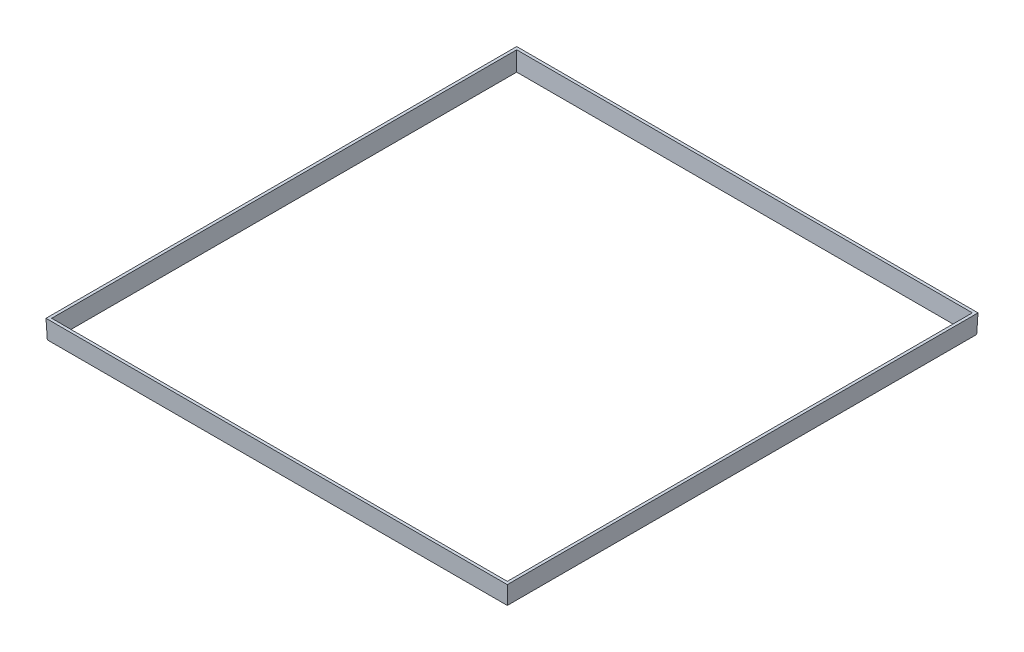
ISO-10303-21;
HEADER;
FILE_DESCRIPTION(('STEP AP214'),'2;1');
FILE_NAME('part.step','',(''),(''),'','','');
FILE_SCHEMA(('AUTOMOTIVE_DESIGN { 1 0 10303 214 1 1 1 1 }'));
ENDSEC;
DATA;
#1=APPLICATION_CONTEXT('core data for automotive mechanical design processes');
#2=APPLICATION_PROTOCOL_DEFINITION('international standard','automotive_design',2000,#1);
#3=PRODUCT_CONTEXT('',#1,'mechanical');
#4=PRODUCT('Part','Part','',(#3));
#5=PRODUCT_RELATED_PRODUCT_CATEGORY('part','',(#4));
#6=PRODUCT_DEFINITION_FORMATION('','',#4);
#7=PRODUCT_DEFINITION_CONTEXT('part definition',#1,'design');
#8=PRODUCT_DEFINITION('design','',#6,#7);
#9=PRODUCT_DEFINITION_SHAPE('','',#8);
#10=(LENGTH_UNIT() NAMED_UNIT(*) SI_UNIT(.MILLI.,.METRE.));
#11=(NAMED_UNIT(*) PLANE_ANGLE_UNIT() SI_UNIT($,.RADIAN.));
#12=(NAMED_UNIT(*) SI_UNIT($,.STERADIAN.) SOLID_ANGLE_UNIT());
#13=UNCERTAINTY_MEASURE_WITH_UNIT(LENGTH_MEASURE(1.E-05),#10,'distance_accuracy_value','');
#14=(GEOMETRIC_REPRESENTATION_CONTEXT(3) GLOBAL_UNCERTAINTY_ASSIGNED_CONTEXT((#13)) GLOBAL_UNIT_ASSIGNED_CONTEXT((#10,
#11,#12)) REPRESENTATION_CONTEXT('',''));
#15=CARTESIAN_POINT('',(0.,0.,0.));
#16=DIRECTION('',(0.,0.,1.));
#17=DIRECTION('',(1.,0.,0.));
#18=AXIS2_PLACEMENT_3D('',#15,#16,#17);
#19=CARTESIAN_POINT('',(123.,0.,125.5));
#20=DIRECTION('',(0.999390827019096,-0.034899496702501,0.));
#21=DIRECTION('',(0.034899496702501,0.999390827019096,0.));
#22=AXIS2_PLACEMENT_3D('',#19,#20,#21);
#23=PLANE('',#22);
#24=DIRECTION('',(0.,0.,1.));
#25=VECTOR('',#24,1.);
#26=CARTESIAN_POINT('',(122.651217372576,-9.98782765958718,-125.5));
#27=LINE('',#26,#25);
#28=CARTESIAN_POINT('',(122.651217372576,-9.98782765958718,-125.151217372576));
#29=VERTEX_POINT('',#28);
#30=CARTESIAN_POINT('',(122.651217372576,-9.98782765958718,125.151217372576));
#31=VERTEX_POINT('',#30);
#32=EDGE_CURVE('E104',#29,#31,#27,.T.);
#33=ORIENTED_EDGE('',*,*,#32,.F.);
#34=DIRECTION('',(0.0348782627423747,0.998782765958718,-0.0348782627423747));
#35=VECTOR('',#34,1.);
#36=CARTESIAN_POINT('',(122.694660203806,-8.74378774114964,-125.194660203806));
#37=LINE('',#36,#35);
#38=CARTESIAN_POINT('',(123.,0.,-125.5));
#39=VERTEX_POINT('',#38);
#40=EDGE_CURVE('E121',#29,#39,#37,.T.);
#41=ORIENTED_EDGE('',*,*,#40,.T.);
#42=DIRECTION('',(0.,0.,-1.));
#43=VECTOR('',#42,1.);
#44=CARTESIAN_POINT('',(123.,0.,125.5));
#45=LINE('',#44,#43);
#46=CARTESIAN_POINT('',(123.,0.,125.5));
#47=VERTEX_POINT('',#46);
#48=EDGE_CURVE('E131',#47,#39,#45,.T.);
#49=ORIENTED_EDGE('',*,*,#48,.F.);
#50=DIRECTION('',(0.0348782627423747,0.998782765958718,0.0348782627423747));
#51=VECTOR('',#50,1.);
#52=CARTESIAN_POINT('',(122.700742669866,-8.56960870248132,125.200742669866));
#53=LINE('',#52,#51);
#54=EDGE_CURVE('E47',#31,#47,#53,.T.);
#55=ORIENTED_EDGE('',*,*,#54,.F.);
#56=EDGE_LOOP('',(#33,#41,#49,#55));
#57=FACE_BOUND('',#56,.T.);
#58=ADVANCED_FACE('F39',(#57),#23,.T.);
#59=CARTESIAN_POINT('',(-123.,0.,125.5));
#60=DIRECTION('',(0.,-0.034899496702501,0.999390827019096));
#61=DIRECTION('',(0.,-0.999390827019096,-0.034899496702501));
#62=AXIS2_PLACEMENT_3D('',#59,#60,#61);
#63=PLANE('',#62);
#64=DIRECTION('',(-1.,0.,0.));
#65=VECTOR('',#64,1.);
#66=CARTESIAN_POINT('',(-122.651217372576,-9.98782765958718,125.151217372576));
#67=LINE('',#66,#65);
#68=CARTESIAN_POINT('',(-122.651217372576,-9.98782765958718,125.151217372576));
#69=VERTEX_POINT('',#68);
#70=EDGE_CURVE('E101',#31,#69,#67,.T.);
#71=ORIENTED_EDGE('',*,*,#70,.F.);
#72=ORIENTED_EDGE('',*,*,#54,.T.);
#73=DIRECTION('',(1.,0.,0.));
#74=VECTOR('',#73,1.);
#75=CARTESIAN_POINT('',(-123.,0.,125.5));
#76=LINE('',#75,#74);
#77=CARTESIAN_POINT('',(-123.,0.,125.5));
#78=VERTEX_POINT('',#77);
#79=EDGE_CURVE('E119',#78,#47,#76,.T.);
#80=ORIENTED_EDGE('',*,*,#79,.F.);
#81=DIRECTION('',(-0.0348782627423747,0.998782765958718,0.0348782627423747));
#82=VECTOR('',#81,1.);
#83=CARTESIAN_POINT('',(-123.,0.,125.5));
#84=LINE('',#83,#82);
#85=EDGE_CURVE('E113',#69,#78,#84,.T.);
#86=ORIENTED_EDGE('',*,*,#85,.F.);
#87=EDGE_LOOP('',(#71,#72,#80,#86));
#88=FACE_BOUND('',#87,.T.);
#89=ADVANCED_FACE('F41',(#88),#63,.T.);
#90=CARTESIAN_POINT('',(-123.,0.,125.5));
#91=DIRECTION('',(-0.999390827019096,-0.034899496702501,0.));
#92=DIRECTION('',(0.034899496702501,-0.999390827019096,0.));
#93=AXIS2_PLACEMENT_3D('',#90,#91,#92);
#94=PLANE('',#93);
#95=DIRECTION('',(0.,0.,1.));
#96=VECTOR('',#95,1.);
#97=CARTESIAN_POINT('',(-122.651217372576,-9.98782765958718,-125.5));
#98=LINE('',#97,#96);
#99=CARTESIAN_POINT('',(-122.651217372576,-9.98782765958718,-125.151217372576));
#100=VERTEX_POINT('',#99);
#101=EDGE_CURVE('E54',#100,#69,#98,.T.);
#102=ORIENTED_EDGE('',*,*,#101,.T.);
#103=ORIENTED_EDGE('',*,*,#85,.T.);
#104=DIRECTION('',(0.,0.,1.));
#105=VECTOR('',#104,1.);
#106=CARTESIAN_POINT('',(-123.,0.,125.5));
#107=LINE('',#106,#105);
#108=CARTESIAN_POINT('',(-123.,0.,-125.5));
#109=VERTEX_POINT('',#108);
#110=EDGE_CURVE('E126',#109,#78,#107,.T.);
#111=ORIENTED_EDGE('',*,*,#110,.F.);
#112=DIRECTION('',(-0.0348782627423747,0.998782765958718,-0.0348782627423747));
#113=VECTOR('',#112,1.);
#114=CARTESIAN_POINT('',(-123.,0.,-125.5));
#115=LINE('',#114,#113);
#116=EDGE_CURVE('E115',#100,#109,#115,.T.);
#117=ORIENTED_EDGE('',*,*,#116,.F.);
#118=EDGE_LOOP('',(#102,#103,#111,#117));
#119=FACE_BOUND('',#118,.T.);
#120=ADVANCED_FACE('F111',(#119),#94,.T.);
#121=CARTESIAN_POINT('',(-123.,0.,-125.5));
#122=DIRECTION('',(0.,-0.034899496702501,-0.999390827019096));
#123=DIRECTION('',(0.,0.999390827019096,-0.034899496702501));
#124=AXIS2_PLACEMENT_3D('',#121,#122,#123);
#125=PLANE('',#124);
#126=DIRECTION('',(1.,0.,0.));
#127=VECTOR('',#126,1.);
#128=CARTESIAN_POINT('',(-123.,-9.98782765958718,-125.151217372576));
#129=LINE('',#128,#127);
#130=EDGE_CURVE('E154',#100,#29,#129,.T.);
#131=ORIENTED_EDGE('',*,*,#130,.F.);
#132=ORIENTED_EDGE('',*,*,#116,.T.);
#133=DIRECTION('',(-1.,0.,0.));
#134=VECTOR('',#133,1.);
#135=CARTESIAN_POINT('',(-123.,0.,-125.5));
#136=LINE('',#135,#134);
#137=EDGE_CURVE('E128',#39,#109,#136,.T.);
#138=ORIENTED_EDGE('',*,*,#137,.F.);
#139=ORIENTED_EDGE('',*,*,#40,.F.);
#140=EDGE_LOOP('',(#131,#132,#138,#139));
#141=FACE_BOUND('',#140,.T.);
#142=ADVANCED_FACE('F190',(#141),#125,.T.);
#143=CARTESIAN_POINT('',(0.,0.,0.));
#144=DIRECTION('',(0.,-1.,0.));
#145=DIRECTION('',(0.,0.,-1.));
#146=AXIS2_PLACEMENT_3D('',#143,#144,#145);
#147=PLANE('',#146);
#148=DIRECTION('',(0.,0.,-1.));
#149=VECTOR('',#148,1.);
#150=CARTESIAN_POINT('',(121.5,0.,124.));
#151=LINE('',#150,#149);
#152=CARTESIAN_POINT('',(121.5,0.,124.));
#153=VERTEX_POINT('',#152);
#154=CARTESIAN_POINT('',(121.5,0.,-124.));
#155=VERTEX_POINT('',#154);
#156=EDGE_CURVE('E148',#153,#155,#151,.T.);
#157=ORIENTED_EDGE('',*,*,#156,.F.);
#158=DIRECTION('',(1.,0.,0.));
#159=VECTOR('',#158,1.);
#160=CARTESIAN_POINT('',(-121.5,0.,124.));
#161=LINE('',#160,#159);
#162=CARTESIAN_POINT('',(-121.5,0.,124.));
#163=VERTEX_POINT('',#162);
#164=EDGE_CURVE('E151',#163,#153,#161,.T.);
#165=ORIENTED_EDGE('',*,*,#164,.F.);
#166=DIRECTION('',(0.,0.,1.));
#167=VECTOR('',#166,1.);
#168=CARTESIAN_POINT('',(-121.5,0.,-124.));
#169=LINE('',#168,#167);
#170=CARTESIAN_POINT('',(-121.5,0.,-124.));
#171=VERTEX_POINT('',#170);
#172=EDGE_CURVE('E141',#171,#163,#169,.T.);
#173=ORIENTED_EDGE('',*,*,#172,.F.);
#174=DIRECTION('',(-1.,0.,0.));
#175=VECTOR('',#174,1.);
#176=CARTESIAN_POINT('',(121.5,0.,-124.));
#177=LINE('',#176,#175);
#178=EDGE_CURVE('E145',#155,#171,#177,.T.);
#179=ORIENTED_EDGE('',*,*,#178,.F.);
#180=EDGE_LOOP('',(#157,#165,#173,#179));
#181=FACE_BOUND('',#180,.T.);
#182=ORIENTED_EDGE('',*,*,#48,.T.);
#183=ORIENTED_EDGE('',*,*,#137,.T.);
#184=ORIENTED_EDGE('',*,*,#110,.T.);
#185=ORIENTED_EDGE('',*,*,#79,.T.);
#186=EDGE_LOOP('',(#182,#183,#184,#185));
#187=FACE_BOUND('',#186,.T.);
#188=ADVANCED_FACE('F175',(#181,#187),#147,.F.);
#189=CARTESIAN_POINT('',(-121.5,0.,124.));
#190=DIRECTION('',(0.,-0.034899496702501,0.999390827019096));
#191=DIRECTION('',(0.,-0.999390827019096,-0.034899496702501));
#192=AXIS2_PLACEMENT_3D('',#189,#190,#191);
#193=PLANE('',#192);
#194=DIRECTION('',(0.0348782627423747,0.998782765958718,0.0348782627423747));
#195=VECTOR('',#194,1.);
#196=CARTESIAN_POINT('',(121.204392149502,-8.46510127928033,123.704392149502));
#197=LINE('',#196,#195);
#198=CARTESIAN_POINT('',(121.151217372576,-9.98782765958718,123.651217372576));
#199=VERTEX_POINT('',#198);
#200=EDGE_CURVE('E139',#199,#153,#197,.T.);
#201=ORIENTED_EDGE('',*,*,#200,.F.);
#202=DIRECTION('',(-1.,0.,0.));
#203=VECTOR('',#202,1.);
#204=CARTESIAN_POINT('',(-121.5,-9.98782765958718,123.651217372576));
#205=LINE('',#204,#203);
#206=CARTESIAN_POINT('',(-121.151217372576,-9.98782765958718,123.651217372576));
#207=VERTEX_POINT('',#206);
#208=EDGE_CURVE('E62',#199,#207,#205,.T.);
#209=ORIENTED_EDGE('',*,*,#208,.T.);
#210=DIRECTION('',(-0.0348782627423747,0.998782765958718,0.0348782627423747));
#211=VECTOR('',#210,1.);
#212=CARTESIAN_POINT('',(-121.198309683442,-8.63928031794865,123.698309683442));
#213=LINE('',#212,#211);
#214=EDGE_CURVE('E134',#207,#163,#213,.T.);
#215=ORIENTED_EDGE('',*,*,#214,.T.);
#216=ORIENTED_EDGE('',*,*,#164,.T.);
#217=EDGE_LOOP('',(#201,#209,#215,#216));
#218=FACE_BOUND('',#217,.T.);
#219=ADVANCED_FACE('F181',(#218),#193,.F.);
#220=CARTESIAN_POINT('',(-121.5,0.,-124.));
#221=DIRECTION('',(-0.999390827019096,-0.034899496702501,0.));
#222=DIRECTION('',(0.034899496702501,-0.999390827019096,0.));
#223=AXIS2_PLACEMENT_3D('',#220,#221,#222);
#224=PLANE('',#223);
#225=ORIENTED_EDGE('',*,*,#214,.F.);
#226=DIRECTION('',(0.,0.,-1.));
#227=VECTOR('',#226,1.);
#228=CARTESIAN_POINT('',(-121.151217372576,-9.98782765958718,-124.));
#229=LINE('',#228,#227);
#230=CARTESIAN_POINT('',(-121.151217372576,-9.98782765958718,-123.651217372576));
#231=VERTEX_POINT('',#230);
#232=EDGE_CURVE('E157',#207,#231,#229,.T.);
#233=ORIENTED_EDGE('',*,*,#232,.T.);
#234=DIRECTION('',(-0.0348782627423747,0.998782765958718,-0.0348782627423747));
#235=VECTOR('',#234,1.);
#236=CARTESIAN_POINT('',(-121.204392149502,-8.46510127928033,-123.704392149502));
#237=LINE('',#236,#235);
#238=EDGE_CURVE('E135',#231,#171,#237,.T.);
#239=ORIENTED_EDGE('',*,*,#238,.T.);
#240=ORIENTED_EDGE('',*,*,#172,.T.);
#241=EDGE_LOOP('',(#225,#233,#239,#240));
#242=FACE_BOUND('',#241,.T.);
#243=ADVANCED_FACE('F179',(#242),#224,.F.);
#244=CARTESIAN_POINT('',(121.5,0.,-124.));
#245=DIRECTION('',(0.,-0.034899496702501,-0.999390827019096));
#246=DIRECTION('',(0.,0.999390827019096,-0.034899496702501));
#247=AXIS2_PLACEMENT_3D('',#244,#245,#246);
#248=PLANE('',#247);
#249=ORIENTED_EDGE('',*,*,#238,.F.);
#250=DIRECTION('',(1.,0.,0.));
#251=VECTOR('',#250,1.);
#252=CARTESIAN_POINT('',(121.5,-9.98782765958718,-123.651217372576));
#253=LINE('',#252,#251);
#254=CARTESIAN_POINT('',(121.151217372576,-9.98782765958718,-123.651217372576));
#255=VERTEX_POINT('',#254);
#256=EDGE_CURVE('E160',#231,#255,#253,.T.);
#257=ORIENTED_EDGE('',*,*,#256,.T.);
#258=DIRECTION('',(0.0348782627423747,0.998782765958718,-0.0348782627423747));
#259=VECTOR('',#258,1.);
#260=CARTESIAN_POINT('',(121.198309683442,-8.63928031794865,-123.698309683442));
#261=LINE('',#260,#259);
#262=EDGE_CURVE('E137',#255,#155,#261,.T.);
#263=ORIENTED_EDGE('',*,*,#262,.T.);
#264=ORIENTED_EDGE('',*,*,#178,.T.);
#265=EDGE_LOOP('',(#249,#257,#263,#264));
#266=FACE_BOUND('',#265,.T.);
#267=ADVANCED_FACE('F166',(#266),#248,.F.);
#268=CARTESIAN_POINT('',(121.5,0.,124.));
#269=DIRECTION('',(0.999390827019096,-0.034899496702501,0.));
#270=DIRECTION('',(0.034899496702501,0.999390827019096,0.));
#271=AXIS2_PLACEMENT_3D('',#268,#269,#270);
#272=PLANE('',#271);
#273=ORIENTED_EDGE('',*,*,#262,.F.);
#274=DIRECTION('',(0.,0.,1.));
#275=VECTOR('',#274,1.);
#276=CARTESIAN_POINT('',(121.151217372576,-9.98782765958718,124.));
#277=LINE('',#276,#275);
#278=EDGE_CURVE('E11',#255,#199,#277,.T.);
#279=ORIENTED_EDGE('',*,*,#278,.T.);
#280=ORIENTED_EDGE('',*,*,#200,.T.);
#281=ORIENTED_EDGE('',*,*,#156,.T.);
#282=EDGE_LOOP('',(#273,#279,#280,#281));
#283=FACE_BOUND('',#282,.T.);
#284=ADVANCED_FACE('F168',(#283),#272,.F.);
#285=CARTESIAN_POINT('',(-122.651217372576,-9.98782765958718,-125.5));
#286=DIRECTION('',(0.,1.,0.));
#287=DIRECTION('',(0.,0.,1.));
#288=AXIS2_PLACEMENT_3D('',#285,#286,#287);
#289=PLANE('',#288);
#290=ORIENTED_EDGE('',*,*,#130,.T.);
#291=ORIENTED_EDGE('',*,*,#32,.T.);
#292=ORIENTED_EDGE('',*,*,#70,.T.);
#293=ORIENTED_EDGE('',*,*,#101,.F.);
#294=EDGE_LOOP('',(#290,#291,#292,#293));
#295=FACE_BOUND('',#294,.T.);
#296=ORIENTED_EDGE('',*,*,#278,.F.);
#297=ORIENTED_EDGE('',*,*,#256,.F.);
#298=ORIENTED_EDGE('',*,*,#232,.F.);
#299=ORIENTED_EDGE('',*,*,#208,.F.);
#300=EDGE_LOOP('',(#296,#297,#298,#299));
#301=FACE_BOUND('',#300,.T.);
#302=ADVANCED_FACE('F102',(#295,#301),#289,.F.);
#303=CLOSED_SHELL('',(#58,#89,#120,#142,#188,#219,#243,#267,#284,#302));
#304=MANIFOLD_SOLID_BREP('B2',#303);
#305=ADVANCED_BREP_SHAPE_REPRESENTATION('',(#18,#304),#14);
#306=SHAPE_DEFINITION_REPRESENTATION(#9,#305);
ENDSEC;
END-ISO-10303-21;
